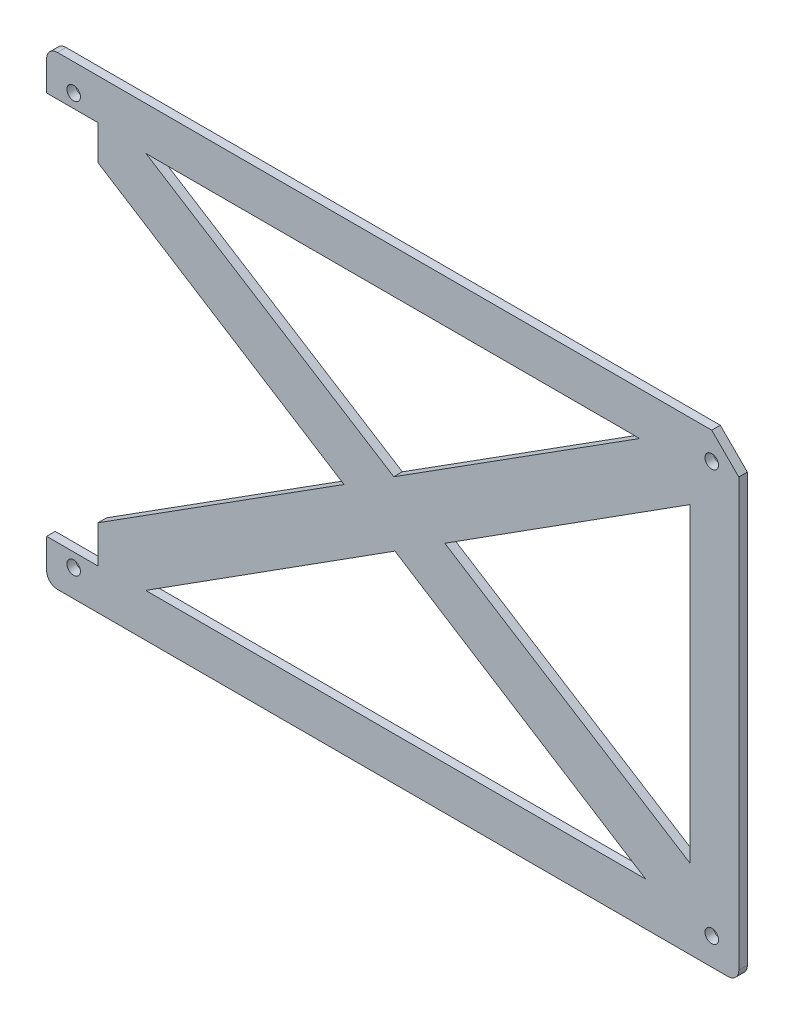
ISO-10303-21;
HEADER;
FILE_DESCRIPTION(('STEP AP214'),'2;1');
FILE_NAME('part.step','',(''),(''),'','','');
FILE_SCHEMA(('AUTOMOTIVE_DESIGN { 1 0 10303 214 1 1 1 1 }'));
ENDSEC;
DATA;
#1=APPLICATION_CONTEXT('core data for automotive mechanical design processes');
#2=APPLICATION_PROTOCOL_DEFINITION('international standard','automotive_design',2000,#1);
#3=PRODUCT_CONTEXT('',#1,'mechanical');
#4=PRODUCT('Part','Part','',(#3));
#5=PRODUCT_RELATED_PRODUCT_CATEGORY('part','',(#4));
#6=PRODUCT_DEFINITION_FORMATION('','',#4);
#7=PRODUCT_DEFINITION_CONTEXT('part definition',#1,'design');
#8=PRODUCT_DEFINITION('design','',#6,#7);
#9=PRODUCT_DEFINITION_SHAPE('','',#8);
#10=(LENGTH_UNIT() NAMED_UNIT(*) SI_UNIT(.MILLI.,.METRE.));
#11=(NAMED_UNIT(*) PLANE_ANGLE_UNIT() SI_UNIT($,.RADIAN.));
#12=(NAMED_UNIT(*) SI_UNIT($,.STERADIAN.) SOLID_ANGLE_UNIT());
#13=UNCERTAINTY_MEASURE_WITH_UNIT(LENGTH_MEASURE(1.E-05),#10,'distance_accuracy_value','');
#14=(GEOMETRIC_REPRESENTATION_CONTEXT(3) GLOBAL_UNCERTAINTY_ASSIGNED_CONTEXT((#13)) GLOBAL_UNIT_ASSIGNED_CONTEXT((#10,
#11,#12)) REPRESENTATION_CONTEXT('',''));
#15=CARTESIAN_POINT('',(0.,0.,0.));
#16=DIRECTION('',(0.,0.,1.));
#17=DIRECTION('',(1.,0.,0.));
#18=AXIS2_PLACEMENT_3D('',#15,#16,#17);
#19=CARTESIAN_POINT('',(62.00000000026,-40.999999998695,1.5875));
#20=DIRECTION('',(0.,0.,1.));
#21=DIRECTION('',(1.,0.,0.));
#22=AXIS2_PLACEMENT_3D('',#19,#20,#21);
#23=PLANE('',#22);
#24=CARTESIAN_POINT('',(59.00000000053,37.999999998965,1.5875));
#25=DIRECTION('',(0.,0.,1.));
#26=DIRECTION('',(1.,0.,0.));
#27=AXIS2_PLACEMENT_3D('',#24,#25,#26);
#28=CIRCLE('',#27,1.24999500014619);
#29=CARTESIAN_POINT('',(60.2499950006762,37.999999998965,1.5875));
#30=VERTEX_POINT('',#29);
#31=EDGE_CURVE('E275',#30,#30,#28,.T.);
#32=ORIENTED_EDGE('',*,*,#31,.F.);
#33=EDGE_LOOP('',(#32));
#34=FACE_BOUND('',#33,.T.);
#35=CARTESIAN_POINT('',(59.00000000053,-37.999999999715,1.5875));
#36=DIRECTION('',(0.,0.,1.));
#37=DIRECTION('',(1.,0.,0.));
#38=AXIS2_PLACEMENT_3D('',#35,#36,#37);
#39=CIRCLE('',#38,1.24999500014619);
#40=CARTESIAN_POINT('',(60.2499950006762,-37.999999999715,1.5875));
#41=VERTEX_POINT('',#40);
#42=EDGE_CURVE('E287',#41,#41,#39,.T.);
#43=ORIENTED_EDGE('',*,*,#42,.F.);
#44=EDGE_LOOP('',(#43));
#45=FACE_BOUND('',#44,.T.);
#46=CARTESIAN_POINT('',(62.00000000026,-40.999999998695,1.5875));
#47=DIRECTION('',(0.,0.,1.));
#48=DIRECTION('',(1.,0.,0.));
#49=AXIS2_PLACEMENT_3D('',#46,#47,#48);
#50=CIRCLE('',#49,2.00000000025);
#51=CARTESIAN_POINT('',(62.00000000026,-42.999999998945,1.5875));
#52=VERTEX_POINT('',#51);
#53=CARTESIAN_POINT('',(64.00000000051,-40.999999998695,1.5875));
#54=VERTEX_POINT('',#53);
#55=EDGE_CURVE('E293',#52,#54,#50,.T.);
#56=ORIENTED_EDGE('',*,*,#55,.T.);
#57=DIRECTION('',(0.,1.,0.));
#58=VECTOR('',#57,1.);
#59=CARTESIAN_POINT('',(64.00000000051,-40.999999998695,1.5875));
#60=LINE('',#59,#58);
#61=CARTESIAN_POINT('',(64.00000000051,37.999999998965,1.5875));
#62=VERTEX_POINT('',#61);
#63=EDGE_CURVE('E296',#54,#62,#60,.T.);
#64=ORIENTED_EDGE('',*,*,#63,.T.);
#65=DIRECTION('',(-0.707106781186548,0.707106781186548,0.));
#66=VECTOR('',#65,1.);
#67=CARTESIAN_POINT('',(64.00000000051,37.999999998965,1.5875));
#68=LINE('',#67,#66);
#69=CARTESIAN_POINT('',(59.00000000053,42.999999998945,1.5875));
#70=VERTEX_POINT('',#69);
#71=EDGE_CURVE('E299',#62,#70,#68,.T.);
#72=ORIENTED_EDGE('',*,*,#71,.T.);
#73=DIRECTION('',(-1.,0.,0.));
#74=VECTOR('',#73,1.);
#75=CARTESIAN_POINT('',(59.00000000053,42.999999998945,1.5875));
#76=LINE('',#75,#74);
#77=CARTESIAN_POINT('',(-62.00000000026,42.999999998945,1.5875));
#78=VERTEX_POINT('',#77);
#79=EDGE_CURVE('E301',#70,#78,#76,.T.);
#80=ORIENTED_EDGE('',*,*,#79,.T.);
#81=CARTESIAN_POINT('',(-62.00000000026,40.999999998695,1.5875));
#82=DIRECTION('',(0.,0.,1.));
#83=DIRECTION('',(1.,0.,0.));
#84=AXIS2_PLACEMENT_3D('',#81,#82,#83);
#85=CIRCLE('',#84,2.00000000025);
#86=CARTESIAN_POINT('',(-64.00000000051,40.999999998695,1.5875));
#87=VERTEX_POINT('',#86);
#88=EDGE_CURVE('E303',#78,#87,#85,.T.);
#89=ORIENTED_EDGE('',*,*,#88,.T.);
#90=DIRECTION('',(0.,-1.,0.));
#91=VECTOR('',#90,1.);
#92=CARTESIAN_POINT('',(-64.00000000051,40.999999998695,1.5875));
#93=LINE('',#92,#91);
#94=CARTESIAN_POINT('',(-64.00000000051,35.5,1.5875));
#95=VERTEX_POINT('',#94);
#96=EDGE_CURVE('E305',#87,#95,#93,.T.);
#97=ORIENTED_EDGE('',*,*,#96,.T.);
#98=DIRECTION('',(1.,0.,0.));
#99=VECTOR('',#98,1.);
#100=CARTESIAN_POINT('',(-64.00000000051,35.5,1.5875));
#101=LINE('',#100,#99);
#102=CARTESIAN_POINT('',(-54.50000000051,35.5,1.5875));
#103=VERTEX_POINT('',#102);
#104=EDGE_CURVE('E307',#95,#103,#101,.T.);
#105=ORIENTED_EDGE('',*,*,#104,.T.);
#106=DIRECTION('',(0.,-1.,0.));
#107=VECTOR('',#106,1.);
#108=CARTESIAN_POINT('',(-54.50000000051,35.5,1.5875));
#109=LINE('',#108,#107);
#110=CARTESIAN_POINT('',(-54.50000000051,29.0865436832252,1.5875));
#111=VERTEX_POINT('',#110);
#112=EDGE_CURVE('E309',#103,#111,#109,.T.);
#113=ORIENTED_EDGE('',*,*,#112,.T.);
#114=DIRECTION('',(0.84501184330285,-0.534747589688743,0.));
#115=VECTOR('',#114,1.);
#116=CARTESIAN_POINT('',(-54.50000000051,29.0865436832252,1.5875));
#117=LINE('',#116,#115);
#118=CARTESIAN_POINT('',(-9.0091115379995,0.298612305784743,1.5875));
#119=VERTEX_POINT('',#118);
#120=EDGE_CURVE('E311',#111,#119,#117,.T.);
#121=ORIENTED_EDGE('',*,*,#120,.T.);
#122=DIRECTION('',(-0.844309246651983,-0.535856227003065,0.));
#123=VECTOR('',#122,1.);
#124=CARTESIAN_POINT('',(-9.0091115379995,0.298612305784743,1.5875));
#125=LINE('',#124,#123);
#126=CARTESIAN_POINT('',(-54.50000000051,-28.5730078395599,1.5875));
#127=VERTEX_POINT('',#126);
#128=EDGE_CURVE('E313',#119,#127,#125,.T.);
#129=ORIENTED_EDGE('',*,*,#128,.T.);
#130=DIRECTION('',(0.,-1.,0.));
#131=VECTOR('',#130,1.);
#132=CARTESIAN_POINT('',(-54.50000000051,-28.5730078395599,1.5875));
#133=LINE('',#132,#131);
#134=CARTESIAN_POINT('',(-54.50000000051,-35.5,1.5875));
#135=VERTEX_POINT('',#134);
#136=EDGE_CURVE('E315',#127,#135,#133,.T.);
#137=ORIENTED_EDGE('',*,*,#136,.T.);
#138=DIRECTION('',(-1.,0.,0.));
#139=VECTOR('',#138,1.);
#140=CARTESIAN_POINT('',(-54.50000000051,-35.5,1.5875));
#141=LINE('',#140,#139);
#142=CARTESIAN_POINT('',(-64.00000000051,-35.5,1.5875));
#143=VERTEX_POINT('',#142);
#144=EDGE_CURVE('E317',#135,#143,#141,.T.);
#145=ORIENTED_EDGE('',*,*,#144,.T.);
#146=DIRECTION('',(0.,-1.,0.));
#147=VECTOR('',#146,1.);
#148=CARTESIAN_POINT('',(-64.00000000051,-35.5,1.5875));
#149=LINE('',#148,#147);
#150=CARTESIAN_POINT('',(-64.00000000051,-40.999999998695,1.5875));
#151=VERTEX_POINT('',#150);
#152=EDGE_CURVE('E319',#143,#151,#149,.T.);
#153=ORIENTED_EDGE('',*,*,#152,.T.);
#154=CARTESIAN_POINT('',(-62.00000000026,-40.999999998695,1.5875));
#155=DIRECTION('',(0.,0.,1.));
#156=DIRECTION('',(1.,0.,0.));
#157=AXIS2_PLACEMENT_3D('',#154,#155,#156);
#158=CIRCLE('',#157,2.00000000025);
#159=CARTESIAN_POINT('',(-62.00000000026,-42.999999998945,1.5875));
#160=VERTEX_POINT('',#159);
#161=EDGE_CURVE('E321',#151,#160,#158,.T.);
#162=ORIENTED_EDGE('',*,*,#161,.T.);
#163=DIRECTION('',(1.,0.,0.));
#164=VECTOR('',#163,1.);
#165=CARTESIAN_POINT('',(-62.00000000026,-42.999999998945,1.5875));
#166=LINE('',#165,#164);
#167=EDGE_CURVE('E323',#160,#52,#166,.T.);
#168=ORIENTED_EDGE('',*,*,#167,.T.);
#169=EDGE_LOOP('',(#56,#64,#72,#80,#89,#97,#105,#113,#121,#129,#137,#145,#153,#162,#168));
#170=FACE_BOUND('',#169,.T.);
#171=CARTESIAN_POINT('',(-59.00000000103,-37.999999999715,1.5875));
#172=DIRECTION('',(0.,0.,1.));
#173=DIRECTION('',(1.,0.,0.));
#174=AXIS2_PLACEMENT_3D('',#171,#172,#173);
#175=CIRCLE('',#174,1.24999500014617);
#176=CARTESIAN_POINT('',(-57.7500050008838,-37.999999999715,1.5875));
#177=VERTEX_POINT('',#176);
#178=EDGE_CURVE('E281',#177,#177,#175,.T.);
#179=ORIENTED_EDGE('',*,*,#178,.F.);
#180=EDGE_LOOP('',(#179));
#181=FACE_BOUND('',#180,.T.);
#182=CARTESIAN_POINT('',(-59.00000000103,37.999999998965,1.5875));
#183=DIRECTION('',(0.,0.,1.));
#184=DIRECTION('',(1.,0.,0.));
#185=AXIS2_PLACEMENT_3D('',#182,#183,#184);
#186=CIRCLE('',#185,1.24999500014617);
#187=CARTESIAN_POINT('',(-57.7500050008838,37.999999998965,1.5875));
#188=VERTEX_POINT('',#187);
#189=EDGE_CURVE('E269',#188,#188,#186,.T.);
#190=ORIENTED_EDGE('',*,*,#189,.F.);
#191=EDGE_LOOP('',(#190));
#192=FACE_BOUND('',#191,.T.);
#193=DIRECTION('',(0.844309246651983,0.535856227003066,0.));
#194=VECTOR('',#193,1.);
#195=CARTESIAN_POINT('',(45.6673128918372,34.999999998945,1.5875));
#196=LINE('',#195,#194);
#197=CARTESIAN_POINT('',(0.200195403707151,6.14346653504343,1.5875));
#198=VERTEX_POINT('',#197);
#199=CARTESIAN_POINT('',(45.6673128918372,34.999999998945,1.5875));
#200=VERTEX_POINT('',#199);
#201=EDGE_CURVE('E247',#198,#200,#196,.T.);
#202=ORIENTED_EDGE('',*,*,#201,.F.);
#203=DIRECTION('',(0.846198586290304,-0.532867668901286,0.));
#204=VECTOR('',#203,1.);
#205=CARTESIAN_POINT('',(-45.6242357777534,34.9999999989449,1.5875));
#206=LINE('',#205,#204);
#207=CARTESIAN_POINT('',(-45.6242357777534,34.9999999989449,1.5875));
#208=VERTEX_POINT('',#207);
#209=EDGE_CURVE('E245',#208,#198,#206,.T.);
#210=ORIENTED_EDGE('',*,*,#209,.F.);
#211=DIRECTION('',(-1.,0.,0.));
#212=VECTOR('',#211,1.);
#213=CARTESIAN_POINT('',(-45.6242357777534,34.9999999989449,1.5875));
#214=LINE('',#213,#212);
#215=EDGE_CURVE('E251',#200,#208,#214,.T.);
#216=ORIENTED_EDGE('',*,*,#215,.F.);
#217=EDGE_LOOP('',(#202,#210,#216));
#218=FACE_BOUND('',#217,.T.);
#219=DIRECTION('',(-0.843598214141836,-0.536974909187296,0.));
#220=VECTOR('',#219,1.);
#221=CARTESIAN_POINT('',(0.409618796281007,-5.6618288218784,1.5875));
#222=LINE('',#221,#220);
#223=CARTESIAN_POINT('',(0.409618796281007,-5.6618288218784,1.5875));
#224=VERTEX_POINT('',#223);
#225=CARTESIAN_POINT('',(-45.6812290025838,-34.999999998945,1.5875));
#226=VERTEX_POINT('',#225);
#227=EDGE_CURVE('E223',#224,#226,#222,.T.);
#228=ORIENTED_EDGE('',*,*,#227,.F.);
#229=DIRECTION('',(-0.845011843302849,0.534747589688744,0.));
#230=VECTOR('',#229,1.);
#231=CARTESIAN_POINT('',(0.409618796281007,-5.6618288218784,1.5875));
#232=LINE('',#231,#230);
#233=CARTESIAN_POINT('',(46.7699999994905,-34.9999999989451,1.5875));
#234=VERTEX_POINT('',#233);
#235=EDGE_CURVE('E221',#234,#224,#232,.T.);
#236=ORIENTED_EDGE('',*,*,#235,.F.);
#237=DIRECTION('',(1.,0.,0.));
#238=VECTOR('',#237,1.);
#239=CARTESIAN_POINT('',(-45.6812290025838,-34.999999998945,1.5875));
#240=LINE('',#239,#238);
#241=EDGE_CURVE('E227',#226,#234,#240,.T.);
#242=ORIENTED_EDGE('',*,*,#241,.F.);
#243=EDGE_LOOP('',(#228,#236,#242));
#244=FACE_BOUND('',#243,.T.);
#245=DIRECTION('',(0.,1.,0.));
#246=VECTOR('',#245,1.);
#247=CARTESIAN_POINT('',(55.0000000005099,29.0865436832252,1.5875));
#248=LINE('',#247,#246);
#249=CARTESIAN_POINT('',(55.0000000005101,-28.3650337210967,1.5875));
#250=VERTEX_POINT('',#249);
#251=CARTESIAN_POINT('',(55.0000000005099,29.0865436832252,1.5875));
#252=VERTEX_POINT('',#251);
#253=EDGE_CURVE('E202',#250,#252,#248,.T.);
#254=ORIENTED_EDGE('',*,*,#253,.F.);
#255=DIRECTION('',(0.846198586290304,-0.532867668901286,0.));
#256=VECTOR('',#255,1.);
#257=CARTESIAN_POINT('',(9.62851721152225,0.206269351334123,1.5875));
#258=LINE('',#257,#256);
#259=CARTESIAN_POINT('',(9.62851721152225,0.206269351334123,1.5875));
#260=VERTEX_POINT('',#259);
#261=EDGE_CURVE('E194',#260,#250,#258,.T.);
#262=ORIENTED_EDGE('',*,*,#261,.F.);
#263=DIRECTION('',(-0.843598214141836,-0.536974909187296,0.));
#264=VECTOR('',#263,1.);
#265=CARTESIAN_POINT('',(55.0000000005099,29.0865436832252,1.5875));
#266=LINE('',#265,#264);
#267=EDGE_CURVE('E211',#252,#260,#266,.T.);
#268=ORIENTED_EDGE('',*,*,#267,.F.);
#269=EDGE_LOOP('',(#254,#262,#268));
#270=FACE_BOUND('',#269,.T.);
#271=ADVANCED_FACE('F33',(#34,#45,#170,#181,#192,#218,#244,#270),#23,.T.);
#272=CARTESIAN_POINT('',(62.00000000026,-40.999999998695,0.));
#273=DIRECTION('',(0.,0.,1.));
#274=DIRECTION('',(1.,0.,0.));
#275=AXIS2_PLACEMENT_3D('',#272,#273,#274);
#276=PLANE('',#275);
#277=DIRECTION('',(-0.845011843302849,0.534747589688744,0.));
#278=VECTOR('',#277,1.);
#279=CARTESIAN_POINT('',(0.409618796281007,-5.6618288218784,0.));
#280=LINE('',#279,#278);
#281=CARTESIAN_POINT('',(46.7699999994905,-34.9999999989451,0.));
#282=VERTEX_POINT('',#281);
#283=CARTESIAN_POINT('',(0.409618796281007,-5.6618288218784,0.));
#284=VERTEX_POINT('',#283);
#285=EDGE_CURVE('E209',#282,#284,#280,.T.);
#286=ORIENTED_EDGE('',*,*,#285,.T.);
#287=DIRECTION('',(-0.843598214141836,-0.536974909187296,0.));
#288=VECTOR('',#287,1.);
#289=CARTESIAN_POINT('',(0.409618796281007,-5.6618288218784,0.));
#290=LINE('',#289,#288);
#291=CARTESIAN_POINT('',(-45.6812290025838,-34.999999998945,0.));
#292=VERTEX_POINT('',#291);
#293=EDGE_CURVE('E232',#284,#292,#290,.T.);
#294=ORIENTED_EDGE('',*,*,#293,.T.);
#295=DIRECTION('',(1.,0.,0.));
#296=VECTOR('',#295,1.);
#297=CARTESIAN_POINT('',(-45.6812290025838,-34.999999998945,0.));
#298=LINE('',#297,#296);
#299=EDGE_CURVE('E224',#292,#282,#298,.T.);
#300=ORIENTED_EDGE('',*,*,#299,.T.);
#301=EDGE_LOOP('',(#286,#294,#300));
#302=FACE_BOUND('',#301,.T.);
#303=CARTESIAN_POINT('',(-59.00000000103,37.999999998965,0.));
#304=DIRECTION('',(0.,0.,1.));
#305=DIRECTION('',(1.,0.,0.));
#306=AXIS2_PLACEMENT_3D('',#303,#304,#305);
#307=CIRCLE('',#306,1.24999500014617);
#308=CARTESIAN_POINT('',(-57.7500050008838,37.999999998965,0.));
#309=VERTEX_POINT('',#308);
#310=EDGE_CURVE('E268',#309,#309,#307,.T.);
#311=ORIENTED_EDGE('',*,*,#310,.T.);
#312=EDGE_LOOP('',(#311));
#313=FACE_BOUND('',#312,.T.);
#314=CARTESIAN_POINT('',(59.00000000053,37.999999998965,0.));
#315=DIRECTION('',(0.,0.,1.));
#316=DIRECTION('',(1.,0.,0.));
#317=AXIS2_PLACEMENT_3D('',#314,#315,#316);
#318=CIRCLE('',#317,1.24999500014619);
#319=CARTESIAN_POINT('',(60.2499950006762,37.999999998965,0.));
#320=VERTEX_POINT('',#319);
#321=EDGE_CURVE('E272',#320,#320,#318,.T.);
#322=ORIENTED_EDGE('',*,*,#321,.T.);
#323=EDGE_LOOP('',(#322));
#324=FACE_BOUND('',#323,.T.);
#325=CARTESIAN_POINT('',(-59.00000000103,-37.999999999715,0.));
#326=DIRECTION('',(0.,0.,1.));
#327=DIRECTION('',(1.,0.,0.));
#328=AXIS2_PLACEMENT_3D('',#325,#326,#327);
#329=CIRCLE('',#328,1.24999500014617);
#330=CARTESIAN_POINT('',(-57.7500050008838,-37.999999999715,0.));
#331=VERTEX_POINT('',#330);
#332=EDGE_CURVE('E278',#331,#331,#329,.T.);
#333=ORIENTED_EDGE('',*,*,#332,.T.);
#334=EDGE_LOOP('',(#333));
#335=FACE_BOUND('',#334,.T.);
#336=CARTESIAN_POINT('',(59.00000000053,-37.999999999715,0.));
#337=DIRECTION('',(0.,0.,1.));
#338=DIRECTION('',(1.,0.,0.));
#339=AXIS2_PLACEMENT_3D('',#336,#337,#338);
#340=CIRCLE('',#339,1.24999500014619);
#341=CARTESIAN_POINT('',(60.2499950006762,-37.999999999715,0.));
#342=VERTEX_POINT('',#341);
#343=EDGE_CURVE('E284',#342,#342,#340,.T.);
#344=ORIENTED_EDGE('',*,*,#343,.T.);
#345=EDGE_LOOP('',(#344));
#346=FACE_BOUND('',#345,.T.);
#347=CARTESIAN_POINT('',(62.00000000026,-40.999999998695,0.));
#348=DIRECTION('',(0.,0.,1.));
#349=DIRECTION('',(1.,0.,0.));
#350=AXIS2_PLACEMENT_3D('',#347,#348,#349);
#351=CIRCLE('',#350,2.00000000025);
#352=CARTESIAN_POINT('',(62.00000000026,-42.999999998945,0.));
#353=VERTEX_POINT('',#352);
#354=CARTESIAN_POINT('',(64.00000000051,-40.999999998695,0.));
#355=VERTEX_POINT('',#354);
#356=EDGE_CURVE('E290',#353,#355,#351,.T.);
#357=ORIENTED_EDGE('',*,*,#356,.F.);
#358=DIRECTION('',(1.,0.,0.));
#359=VECTOR('',#358,1.);
#360=CARTESIAN_POINT('',(-62.00000000026,-42.999999998945,0.));
#361=LINE('',#360,#359);
#362=CARTESIAN_POINT('',(-62.00000000026,-42.999999998945,0.));
#363=VERTEX_POINT('',#362);
#364=EDGE_CURVE('E297',#363,#353,#361,.T.);
#365=ORIENTED_EDGE('',*,*,#364,.F.);
#366=CARTESIAN_POINT('',(-62.00000000026,-40.999999998695,0.));
#367=DIRECTION('',(0.,0.,1.));
#368=DIRECTION('',(1.,0.,0.));
#369=AXIS2_PLACEMENT_3D('',#366,#367,#368);
#370=CIRCLE('',#369,2.00000000025);
#371=CARTESIAN_POINT('',(-64.00000000051,-40.999999998695,0.));
#372=VERTEX_POINT('',#371);
#373=EDGE_CURVE('E352',#372,#363,#370,.T.);
#374=ORIENTED_EDGE('',*,*,#373,.F.);
#375=DIRECTION('',(0.,-1.,0.));
#376=VECTOR('',#375,1.);
#377=CARTESIAN_POINT('',(-64.00000000051,-35.5,0.));
#378=LINE('',#377,#376);
#379=CARTESIAN_POINT('',(-64.00000000051,-35.5,0.));
#380=VERTEX_POINT('',#379);
#381=EDGE_CURVE('E350',#380,#372,#378,.T.);
#382=ORIENTED_EDGE('',*,*,#381,.F.);
#383=DIRECTION('',(-1.,0.,0.));
#384=VECTOR('',#383,1.);
#385=CARTESIAN_POINT('',(-54.50000000051,-35.5,0.));
#386=LINE('',#385,#384);
#387=CARTESIAN_POINT('',(-54.50000000051,-35.5,0.));
#388=VERTEX_POINT('',#387);
#389=EDGE_CURVE('E348',#388,#380,#386,.T.);
#390=ORIENTED_EDGE('',*,*,#389,.F.);
#391=DIRECTION('',(0.,-1.,0.));
#392=VECTOR('',#391,1.);
#393=CARTESIAN_POINT('',(-54.50000000051,-28.5730078395599,0.));
#394=LINE('',#393,#392);
#395=CARTESIAN_POINT('',(-54.50000000051,-28.5730078395599,0.));
#396=VERTEX_POINT('',#395);
#397=EDGE_CURVE('E346',#396,#388,#394,.T.);
#398=ORIENTED_EDGE('',*,*,#397,.F.);
#399=DIRECTION('',(-0.844309246651983,-0.535856227003065,0.));
#400=VECTOR('',#399,1.);
#401=CARTESIAN_POINT('',(-9.0091115379995,0.298612305784743,0.));
#402=LINE('',#401,#400);
#403=CARTESIAN_POINT('',(-9.0091115379995,0.298612305784743,0.));
#404=VERTEX_POINT('',#403);
#405=EDGE_CURVE('E344',#404,#396,#402,.T.);
#406=ORIENTED_EDGE('',*,*,#405,.F.);
#407=DIRECTION('',(0.84501184330285,-0.534747589688743,0.));
#408=VECTOR('',#407,1.);
#409=CARTESIAN_POINT('',(-54.50000000051,29.0865436832252,0.));
#410=LINE('',#409,#408);
#411=CARTESIAN_POINT('',(-54.50000000051,29.0865436832252,0.));
#412=VERTEX_POINT('',#411);
#413=EDGE_CURVE('E342',#412,#404,#410,.T.);
#414=ORIENTED_EDGE('',*,*,#413,.F.);
#415=DIRECTION('',(0.,-1.,0.));
#416=VECTOR('',#415,1.);
#417=CARTESIAN_POINT('',(-54.50000000051,35.5,0.));
#418=LINE('',#417,#416);
#419=CARTESIAN_POINT('',(-54.50000000051,35.5,0.));
#420=VERTEX_POINT('',#419);
#421=EDGE_CURVE('E340',#420,#412,#418,.T.);
#422=ORIENTED_EDGE('',*,*,#421,.F.);
#423=DIRECTION('',(1.,0.,0.));
#424=VECTOR('',#423,1.);
#425=CARTESIAN_POINT('',(-64.00000000051,35.5,0.));
#426=LINE('',#425,#424);
#427=CARTESIAN_POINT('',(-64.00000000051,35.5,0.));
#428=VERTEX_POINT('',#427);
#429=EDGE_CURVE('E338',#428,#420,#426,.T.);
#430=ORIENTED_EDGE('',*,*,#429,.F.);
#431=DIRECTION('',(0.,-1.,0.));
#432=VECTOR('',#431,1.);
#433=CARTESIAN_POINT('',(-64.00000000051,40.999999998695,0.));
#434=LINE('',#433,#432);
#435=CARTESIAN_POINT('',(-64.00000000051,40.999999998695,0.));
#436=VERTEX_POINT('',#435);
#437=EDGE_CURVE('E336',#436,#428,#434,.T.);
#438=ORIENTED_EDGE('',*,*,#437,.F.);
#439=CARTESIAN_POINT('',(-62.00000000026,40.999999998695,0.));
#440=DIRECTION('',(0.,0.,1.));
#441=DIRECTION('',(1.,0.,0.));
#442=AXIS2_PLACEMENT_3D('',#439,#440,#441);
#443=CIRCLE('',#442,2.00000000025);
#444=CARTESIAN_POINT('',(-62.00000000026,42.999999998945,0.));
#445=VERTEX_POINT('',#444);
#446=EDGE_CURVE('E334',#445,#436,#443,.T.);
#447=ORIENTED_EDGE('',*,*,#446,.F.);
#448=DIRECTION('',(-1.,0.,0.));
#449=VECTOR('',#448,1.);
#450=CARTESIAN_POINT('',(59.00000000053,42.999999998945,0.));
#451=LINE('',#450,#449);
#452=CARTESIAN_POINT('',(59.00000000053,42.999999998945,0.));
#453=VERTEX_POINT('',#452);
#454=EDGE_CURVE('E332',#453,#445,#451,.T.);
#455=ORIENTED_EDGE('',*,*,#454,.F.);
#456=DIRECTION('',(-0.707106781186548,0.707106781186548,0.));
#457=VECTOR('',#456,1.);
#458=CARTESIAN_POINT('',(64.00000000051,37.999999998965,0.));
#459=LINE('',#458,#457);
#460=CARTESIAN_POINT('',(64.00000000051,37.999999998965,0.));
#461=VERTEX_POINT('',#460);
#462=EDGE_CURVE('E330',#461,#453,#459,.T.);
#463=ORIENTED_EDGE('',*,*,#462,.F.);
#464=DIRECTION('',(0.,1.,0.));
#465=VECTOR('',#464,1.);
#466=CARTESIAN_POINT('',(64.00000000051,-40.999999998695,0.));
#467=LINE('',#466,#465);
#468=EDGE_CURVE('E328',#355,#461,#467,.T.);
#469=ORIENTED_EDGE('',*,*,#468,.F.);
#470=EDGE_LOOP('',(#357,#365,#374,#382,#390,#398,#406,#414,#422,#430,#438,#447,#455,#463,#469));
#471=FACE_BOUND('',#470,.T.);
#472=DIRECTION('',(0.846198586290304,-0.532867668901286,0.));
#473=VECTOR('',#472,1.);
#474=CARTESIAN_POINT('',(-45.6242357777534,34.9999999989449,0.));
#475=LINE('',#474,#473);
#476=CARTESIAN_POINT('',(-45.6242357777534,34.9999999989449,0.));
#477=VERTEX_POINT('',#476);
#478=CARTESIAN_POINT('',(0.200195403707151,6.14346653504343,0.));
#479=VERTEX_POINT('',#478);
#480=EDGE_CURVE('E244',#477,#479,#475,.T.);
#481=ORIENTED_EDGE('',*,*,#480,.T.);
#482=DIRECTION('',(0.844309246651983,0.535856227003066,0.));
#483=VECTOR('',#482,1.);
#484=CARTESIAN_POINT('',(45.6673128918372,34.999999998945,0.));
#485=LINE('',#484,#483);
#486=CARTESIAN_POINT('',(45.6673128918372,34.999999998945,0.));
#487=VERTEX_POINT('',#486);
#488=EDGE_CURVE('E256',#479,#487,#485,.T.);
#489=ORIENTED_EDGE('',*,*,#488,.T.);
#490=DIRECTION('',(-1.,0.,0.));
#491=VECTOR('',#490,1.);
#492=CARTESIAN_POINT('',(-45.6242357777534,34.9999999989449,0.));
#493=LINE('',#492,#491);
#494=EDGE_CURVE('E248',#487,#477,#493,.T.);
#495=ORIENTED_EDGE('',*,*,#494,.T.);
#496=EDGE_LOOP('',(#481,#489,#495));
#497=FACE_BOUND('',#496,.T.);
#498=DIRECTION('',(0.846198586290304,-0.532867668901286,0.));
#499=VECTOR('',#498,1.);
#500=CARTESIAN_POINT('',(9.62851721152225,0.206269351334123,0.));
#501=LINE('',#500,#499);
#502=CARTESIAN_POINT('',(9.62851721152224,0.206269351334139,0.));
#503=VERTEX_POINT('',#502);
#504=CARTESIAN_POINT('',(55.0000000005101,-28.3650337210967,0.));
#505=VERTEX_POINT('',#504);
#506=EDGE_CURVE('E56',#503,#505,#501,.T.);
#507=ORIENTED_EDGE('',*,*,#506,.T.);
#508=DIRECTION('',(0.,1.,0.));
#509=VECTOR('',#508,1.);
#510=CARTESIAN_POINT('',(55.0000000005099,29.0865436832252,0.));
#511=LINE('',#510,#509);
#512=CARTESIAN_POINT('',(55.0000000005099,29.0865436832252,0.));
#513=VERTEX_POINT('',#512);
#514=EDGE_CURVE('E208',#505,#513,#511,.T.);
#515=ORIENTED_EDGE('',*,*,#514,.T.);
#516=DIRECTION('',(-0.843598214141836,-0.536974909187296,0.));
#517=VECTOR('',#516,1.);
#518=CARTESIAN_POINT('',(55.0000000005099,29.0865436832252,0.));
#519=LINE('',#518,#517);
#520=EDGE_CURVE('E203',#513,#503,#519,.T.);
#521=ORIENTED_EDGE('',*,*,#520,.T.);
#522=EDGE_LOOP('',(#507,#515,#521));
#523=FACE_BOUND('',#522,.T.);
#524=ADVANCED_FACE('F403',(#302,#313,#324,#335,#346,#471,#497,#523),#276,.F.);
#525=CARTESIAN_POINT('',(62.00000000026,-40.999999998695,1.5875));
#526=DIRECTION('',(0.,0.,-1.));
#527=DIRECTION('',(-1.,0.,0.));
#528=AXIS2_PLACEMENT_3D('',#525,#526,#527);
#529=CYLINDRICAL_SURFACE('',#528,2.00000000025);
#530=ORIENTED_EDGE('',*,*,#356,.T.);
#531=DIRECTION('',(0.,0.,-1.));
#532=VECTOR('',#531,1.);
#533=CARTESIAN_POINT('',(64.00000000051,-40.999999998695,1.5875));
#534=LINE('',#533,#532);
#535=EDGE_CURVE('E11',#54,#355,#534,.T.);
#536=ORIENTED_EDGE('',*,*,#535,.F.);
#537=ORIENTED_EDGE('',*,*,#55,.F.);
#538=DIRECTION('',(0.,0.,-1.));
#539=VECTOR('',#538,1.);
#540=CARTESIAN_POINT('',(62.00000000026,-42.999999998945,1.5875));
#541=LINE('',#540,#539);
#542=EDGE_CURVE('E325',#52,#353,#541,.T.);
#543=ORIENTED_EDGE('',*,*,#542,.T.);
#544=EDGE_LOOP('',(#530,#536,#537,#543));
#545=FACE_BOUND('',#544,.T.);
#546=ADVANCED_FACE('F35',(#545),#529,.T.);
#547=CARTESIAN_POINT('',(64.00000000051,-40.999999998695,1.5875));
#548=DIRECTION('',(-1.,0.,0.));
#549=DIRECTION('',(0.,0.,1.));
#550=AXIS2_PLACEMENT_3D('',#547,#548,#549);
#551=PLANE('',#550);
#552=ORIENTED_EDGE('',*,*,#468,.T.);
#553=DIRECTION('',(0.,0.,-1.));
#554=VECTOR('',#553,1.);
#555=CARTESIAN_POINT('',(64.00000000051,37.999999998965,1.5875));
#556=LINE('',#555,#554);
#557=EDGE_CURVE('E41',#62,#461,#556,.T.);
#558=ORIENTED_EDGE('',*,*,#557,.F.);
#559=ORIENTED_EDGE('',*,*,#63,.F.);
#560=ORIENTED_EDGE('',*,*,#535,.T.);
#561=EDGE_LOOP('',(#552,#558,#559,#560));
#562=FACE_BOUND('',#561,.T.);
#563=ADVANCED_FACE('F421',(#562),#551,.F.);
#564=CARTESIAN_POINT('',(64.00000000051,37.999999998965,1.5875));
#565=DIRECTION('',(-0.707106781186548,-0.707106781186548,0.));
#566=DIRECTION('',(0.707106781186548,-0.707106781186548,0.));
#567=AXIS2_PLACEMENT_3D('',#564,#565,#566);
#568=PLANE('',#567);
#569=ORIENTED_EDGE('',*,*,#462,.T.);
#570=DIRECTION('',(0.,0.,-1.));
#571=VECTOR('',#570,1.);
#572=CARTESIAN_POINT('',(59.00000000053,42.999999998945,1.5875));
#573=LINE('',#572,#571);
#574=EDGE_CURVE('E390',#70,#453,#573,.T.);
#575=ORIENTED_EDGE('',*,*,#574,.F.);
#576=ORIENTED_EDGE('',*,*,#71,.F.);
#577=ORIENTED_EDGE('',*,*,#557,.T.);
#578=EDGE_LOOP('',(#569,#575,#576,#577));
#579=FACE_BOUND('',#578,.T.);
#580=ADVANCED_FACE('F397',(#579),#568,.F.);
#581=CARTESIAN_POINT('',(59.00000000053,42.999999998945,1.5875));
#582=DIRECTION('',(0.,-1.,0.));
#583=DIRECTION('',(0.,0.,-1.));
#584=AXIS2_PLACEMENT_3D('',#581,#582,#583);
#585=PLANE('',#584);
#586=ORIENTED_EDGE('',*,*,#454,.T.);
#587=DIRECTION('',(0.,0.,-1.));
#588=VECTOR('',#587,1.);
#589=CARTESIAN_POINT('',(-62.00000000026,42.999999998945,1.5875));
#590=LINE('',#589,#588);
#591=EDGE_CURVE('E387',#78,#445,#590,.T.);
#592=ORIENTED_EDGE('',*,*,#591,.F.);
#593=ORIENTED_EDGE('',*,*,#79,.F.);
#594=ORIENTED_EDGE('',*,*,#574,.T.);
#595=EDGE_LOOP('',(#586,#592,#593,#594));
#596=FACE_BOUND('',#595,.T.);
#597=ADVANCED_FACE('F409',(#596),#585,.F.);
#598=CARTESIAN_POINT('',(-62.00000000026,40.999999998695,1.5875));
#599=DIRECTION('',(0.,0.,-1.));
#600=DIRECTION('',(-1.,0.,0.));
#601=AXIS2_PLACEMENT_3D('',#598,#599,#600);
#602=CYLINDRICAL_SURFACE('',#601,2.00000000025);
#603=ORIENTED_EDGE('',*,*,#446,.T.);
#604=DIRECTION('',(0.,0.,-1.));
#605=VECTOR('',#604,1.);
#606=CARTESIAN_POINT('',(-64.00000000051,40.999999998695,1.5875));
#607=LINE('',#606,#605);
#608=EDGE_CURVE('E384',#87,#436,#607,.T.);
#609=ORIENTED_EDGE('',*,*,#608,.F.);
#610=ORIENTED_EDGE('',*,*,#88,.F.);
#611=ORIENTED_EDGE('',*,*,#591,.T.);
#612=EDGE_LOOP('',(#603,#609,#610,#611));
#613=FACE_BOUND('',#612,.T.);
#614=ADVANCED_FACE('F413',(#613),#602,.T.);
#615=CARTESIAN_POINT('',(-64.00000000051,40.999999998695,1.5875));
#616=DIRECTION('',(1.,0.,0.));
#617=DIRECTION('',(0.,0.,-1.));
#618=AXIS2_PLACEMENT_3D('',#615,#616,#617);
#619=PLANE('',#618);
#620=ORIENTED_EDGE('',*,*,#437,.T.);
#621=DIRECTION('',(0.,0.,-1.));
#622=VECTOR('',#621,1.);
#623=CARTESIAN_POINT('',(-64.00000000051,35.5,1.5875));
#624=LINE('',#623,#622);
#625=EDGE_CURVE('E381',#95,#428,#624,.T.);
#626=ORIENTED_EDGE('',*,*,#625,.F.);
#627=ORIENTED_EDGE('',*,*,#96,.F.);
#628=ORIENTED_EDGE('',*,*,#608,.T.);
#629=EDGE_LOOP('',(#620,#626,#627,#628));
#630=FACE_BOUND('',#629,.T.);
#631=ADVANCED_FACE('F469',(#630),#619,.F.);
#632=CARTESIAN_POINT('',(-64.00000000051,35.5,1.5875));
#633=DIRECTION('',(0.,1.,0.));
#634=DIRECTION('',(-1.,0.,0.));
#635=AXIS2_PLACEMENT_3D('',#632,#633,#634);
#636=PLANE('',#635);
#637=ORIENTED_EDGE('',*,*,#429,.T.);
#638=DIRECTION('',(0.,0.,-1.));
#639=VECTOR('',#638,1.);
#640=CARTESIAN_POINT('',(-54.50000000051,35.5,1.5875));
#641=LINE('',#640,#639);
#642=EDGE_CURVE('E378',#103,#420,#641,.T.);
#643=ORIENTED_EDGE('',*,*,#642,.F.);
#644=ORIENTED_EDGE('',*,*,#104,.F.);
#645=ORIENTED_EDGE('',*,*,#625,.T.);
#646=EDGE_LOOP('',(#637,#643,#644,#645));
#647=FACE_BOUND('',#646,.T.);
#648=ADVANCED_FACE('F467',(#647),#636,.F.);
#649=CARTESIAN_POINT('',(-54.50000000051,35.5,1.5875));
#650=DIRECTION('',(1.,0.,0.));
#651=DIRECTION('',(0.,0.,-1.));
#652=AXIS2_PLACEMENT_3D('',#649,#650,#651);
#653=PLANE('',#652);
#654=ORIENTED_EDGE('',*,*,#421,.T.);
#655=DIRECTION('',(0.,0.,-1.));
#656=VECTOR('',#655,1.);
#657=CARTESIAN_POINT('',(-54.50000000051,29.0865436832252,1.5875));
#658=LINE('',#657,#656);
#659=EDGE_CURVE('E375',#111,#412,#658,.T.);
#660=ORIENTED_EDGE('',*,*,#659,.F.);
#661=ORIENTED_EDGE('',*,*,#112,.F.);
#662=ORIENTED_EDGE('',*,*,#642,.T.);
#663=EDGE_LOOP('',(#654,#660,#661,#662));
#664=FACE_BOUND('',#663,.T.);
#665=ADVANCED_FACE('F463',(#664),#653,.F.);
#666=CARTESIAN_POINT('',(-54.50000000051,29.0865436832252,1.5875));
#667=DIRECTION('',(0.534747589688743,0.84501184330285,0.));
#668=DIRECTION('',(-0.84501184330285,0.534747589688743,0.));
#669=AXIS2_PLACEMENT_3D('',#666,#667,#668);
#670=PLANE('',#669);
#671=ORIENTED_EDGE('',*,*,#413,.T.);
#672=DIRECTION('',(0.,0.,-1.));
#673=VECTOR('',#672,1.);
#674=CARTESIAN_POINT('',(-9.0091115379995,0.298612305784743,1.5875));
#675=LINE('',#674,#673);
#676=EDGE_CURVE('E372',#119,#404,#675,.T.);
#677=ORIENTED_EDGE('',*,*,#676,.F.);
#678=ORIENTED_EDGE('',*,*,#120,.F.);
#679=ORIENTED_EDGE('',*,*,#659,.T.);
#680=EDGE_LOOP('',(#671,#677,#678,#679));
#681=FACE_BOUND('',#680,.T.);
#682=ADVANCED_FACE('F458',(#681),#670,.F.);
#683=CARTESIAN_POINT('',(-9.0091115379995,0.298612305784743,1.5875));
#684=DIRECTION('',(0.535856227003065,-0.844309246651983,0.));
#685=DIRECTION('',(0.844309246651984,0.535856227003065,0.));
#686=AXIS2_PLACEMENT_3D('',#683,#684,#685);
#687=PLANE('',#686);
#688=ORIENTED_EDGE('',*,*,#405,.T.);
#689=DIRECTION('',(0.,0.,-1.));
#690=VECTOR('',#689,1.);
#691=CARTESIAN_POINT('',(-54.50000000051,-28.5730078395599,1.5875));
#692=LINE('',#691,#690);
#693=EDGE_CURVE('E369',#127,#396,#692,.T.);
#694=ORIENTED_EDGE('',*,*,#693,.F.);
#695=ORIENTED_EDGE('',*,*,#128,.F.);
#696=ORIENTED_EDGE('',*,*,#676,.T.);
#697=EDGE_LOOP('',(#688,#694,#695,#696));
#698=FACE_BOUND('',#697,.T.);
#699=ADVANCED_FACE('F452',(#698),#687,.F.);
#700=CARTESIAN_POINT('',(-54.50000000051,-28.5730078395599,1.5875));
#701=DIRECTION('',(1.,0.,0.));
#702=DIRECTION('',(0.,0.,-1.));
#703=AXIS2_PLACEMENT_3D('',#700,#701,#702);
#704=PLANE('',#703);
#705=ORIENTED_EDGE('',*,*,#397,.T.);
#706=DIRECTION('',(0.,0.,-1.));
#707=VECTOR('',#706,1.);
#708=CARTESIAN_POINT('',(-54.50000000051,-35.5,1.5875));
#709=LINE('',#708,#707);
#710=EDGE_CURVE('E366',#135,#388,#709,.T.);
#711=ORIENTED_EDGE('',*,*,#710,.F.);
#712=ORIENTED_EDGE('',*,*,#136,.F.);
#713=ORIENTED_EDGE('',*,*,#693,.T.);
#714=EDGE_LOOP('',(#705,#711,#712,#713));
#715=FACE_BOUND('',#714,.T.);
#716=ADVANCED_FACE('F448',(#715),#704,.F.);
#717=CARTESIAN_POINT('',(-54.50000000051,-35.5,1.5875));
#718=DIRECTION('',(0.,-1.,0.));
#719=DIRECTION('',(0.,0.,-1.));
#720=AXIS2_PLACEMENT_3D('',#717,#718,#719);
#721=PLANE('',#720);
#722=ORIENTED_EDGE('',*,*,#389,.T.);
#723=DIRECTION('',(0.,0.,-1.));
#724=VECTOR('',#723,1.);
#725=CARTESIAN_POINT('',(-64.00000000051,-35.5,1.5875));
#726=LINE('',#725,#724);
#727=EDGE_CURVE('E363',#143,#380,#726,.T.);
#728=ORIENTED_EDGE('',*,*,#727,.F.);
#729=ORIENTED_EDGE('',*,*,#144,.F.);
#730=ORIENTED_EDGE('',*,*,#710,.T.);
#731=EDGE_LOOP('',(#722,#728,#729,#730));
#732=FACE_BOUND('',#731,.T.);
#733=ADVANCED_FACE('F443',(#732),#721,.F.);
#734=CARTESIAN_POINT('',(-64.00000000051,-35.5,1.5875));
#735=DIRECTION('',(1.,0.,0.));
#736=DIRECTION('',(0.,0.,-1.));
#737=AXIS2_PLACEMENT_3D('',#734,#735,#736);
#738=PLANE('',#737);
#739=ORIENTED_EDGE('',*,*,#381,.T.);
#740=DIRECTION('',(0.,0.,-1.));
#741=VECTOR('',#740,1.);
#742=CARTESIAN_POINT('',(-64.00000000051,-40.999999998695,1.5875));
#743=LINE('',#742,#741);
#744=EDGE_CURVE('E360',#151,#372,#743,.T.);
#745=ORIENTED_EDGE('',*,*,#744,.F.);
#746=ORIENTED_EDGE('',*,*,#152,.F.);
#747=ORIENTED_EDGE('',*,*,#727,.T.);
#748=EDGE_LOOP('',(#739,#745,#746,#747));
#749=FACE_BOUND('',#748,.T.);
#750=ADVANCED_FACE('F437',(#749),#738,.F.);
#751=CARTESIAN_POINT('',(-62.00000000026,-40.999999998695,1.5875));
#752=DIRECTION('',(0.,0.,-1.));
#753=DIRECTION('',(-1.,0.,0.));
#754=AXIS2_PLACEMENT_3D('',#751,#752,#753);
#755=CYLINDRICAL_SURFACE('',#754,2.00000000025);
#756=ORIENTED_EDGE('',*,*,#373,.T.);
#757=DIRECTION('',(0.,0.,-1.));
#758=VECTOR('',#757,1.);
#759=CARTESIAN_POINT('',(-62.00000000026,-42.999999998945,1.5875));
#760=LINE('',#759,#758);
#761=EDGE_CURVE('E357',#160,#363,#760,.T.);
#762=ORIENTED_EDGE('',*,*,#761,.F.);
#763=ORIENTED_EDGE('',*,*,#161,.F.);
#764=ORIENTED_EDGE('',*,*,#744,.T.);
#765=EDGE_LOOP('',(#756,#762,#763,#764));
#766=FACE_BOUND('',#765,.T.);
#767=ADVANCED_FACE('F433',(#766),#755,.T.);
#768=CARTESIAN_POINT('',(-62.00000000026,-42.999999998945,1.5875));
#769=DIRECTION('',(0.,1.,0.));
#770=DIRECTION('',(0.,0.,1.));
#771=AXIS2_PLACEMENT_3D('',#768,#769,#770);
#772=PLANE('',#771);
#773=ORIENTED_EDGE('',*,*,#364,.T.);
#774=ORIENTED_EDGE('',*,*,#542,.F.);
#775=ORIENTED_EDGE('',*,*,#167,.F.);
#776=ORIENTED_EDGE('',*,*,#761,.T.);
#777=EDGE_LOOP('',(#773,#774,#775,#776));
#778=FACE_BOUND('',#777,.T.);
#779=ADVANCED_FACE('F428',(#778),#772,.F.);
#780=CARTESIAN_POINT('',(59.00000000053,-37.999999999715,1.5875));
#781=DIRECTION('',(0.,0.,-1.));
#782=DIRECTION('',(-1.,0.,0.));
#783=AXIS2_PLACEMENT_3D('',#780,#781,#782);
#784=CYLINDRICAL_SURFACE('',#783,1.24999500014619);
#785=ORIENTED_EDGE('',*,*,#42,.T.);
#786=EDGE_LOOP('',(#785));
#787=FACE_BOUND('',#786,.T.);
#788=ORIENTED_EDGE('',*,*,#343,.F.);
#789=EDGE_LOOP('',(#788));
#790=FACE_BOUND('',#789,.T.);
#791=ADVANCED_FACE('F489',(#787,#790),#784,.F.);
#792=CARTESIAN_POINT('',(-59.00000000103,-37.999999999715,1.5875));
#793=DIRECTION('',(0.,0.,-1.));
#794=DIRECTION('',(-1.,0.,0.));
#795=AXIS2_PLACEMENT_3D('',#792,#793,#794);
#796=CYLINDRICAL_SURFACE('',#795,1.24999500014617);
#797=ORIENTED_EDGE('',*,*,#178,.T.);
#798=EDGE_LOOP('',(#797));
#799=FACE_BOUND('',#798,.T.);
#800=ORIENTED_EDGE('',*,*,#332,.F.);
#801=EDGE_LOOP('',(#800));
#802=FACE_BOUND('',#801,.T.);
#803=ADVANCED_FACE('F545',(#799,#802),#796,.F.);
#804=CARTESIAN_POINT('',(59.00000000053,37.999999998965,1.5875));
#805=DIRECTION('',(0.,0.,-1.));
#806=DIRECTION('',(-1.,0.,0.));
#807=AXIS2_PLACEMENT_3D('',#804,#805,#806);
#808=CYLINDRICAL_SURFACE('',#807,1.24999500014619);
#809=ORIENTED_EDGE('',*,*,#31,.T.);
#810=EDGE_LOOP('',(#809));
#811=FACE_BOUND('',#810,.T.);
#812=ORIENTED_EDGE('',*,*,#321,.F.);
#813=EDGE_LOOP('',(#812));
#814=FACE_BOUND('',#813,.T.);
#815=ADVANCED_FACE('F552',(#811,#814),#808,.F.);
#816=CARTESIAN_POINT('',(-59.00000000103,37.999999998965,1.5875));
#817=DIRECTION('',(0.,0.,-1.));
#818=DIRECTION('',(-1.,0.,0.));
#819=AXIS2_PLACEMENT_3D('',#816,#817,#818);
#820=CYLINDRICAL_SURFACE('',#819,1.24999500014617);
#821=ORIENTED_EDGE('',*,*,#189,.T.);
#822=EDGE_LOOP('',(#821));
#823=FACE_BOUND('',#822,.T.);
#824=ORIENTED_EDGE('',*,*,#310,.F.);
#825=EDGE_LOOP('',(#824));
#826=FACE_BOUND('',#825,.T.);
#827=ADVANCED_FACE('F559',(#823,#826),#820,.F.);
#828=CARTESIAN_POINT('',(-45.6242357777534,34.9999999989449,1.5875));
#829=DIRECTION('',(0.532867668901286,0.846198586290304,0.));
#830=DIRECTION('',(-0.846198586290304,0.532867668901286,0.));
#831=AXIS2_PLACEMENT_3D('',#828,#829,#830);
#832=PLANE('',#831);
#833=ORIENTED_EDGE('',*,*,#480,.F.);
#834=DIRECTION('',(0.,0.,-1.));
#835=VECTOR('',#834,1.);
#836=CARTESIAN_POINT('',(-45.6242357777534,34.9999999989449,1.5875));
#837=LINE('',#836,#835);
#838=EDGE_CURVE('E253',#208,#477,#837,.T.);
#839=ORIENTED_EDGE('',*,*,#838,.F.);
#840=ORIENTED_EDGE('',*,*,#209,.T.);
#841=DIRECTION('',(0.,0.,-1.));
#842=VECTOR('',#841,1.);
#843=CARTESIAN_POINT('',(0.200195403707151,6.14346653504343,1.5875));
#844=LINE('',#843,#842);
#845=EDGE_CURVE('E265',#198,#479,#844,.T.);
#846=ORIENTED_EDGE('',*,*,#845,.T.);
#847=EDGE_LOOP('',(#833,#839,#840,#846));
#848=FACE_BOUND('',#847,.T.);
#849=ADVANCED_FACE('F567',(#848),#832,.T.);
#850=CARTESIAN_POINT('',(45.6673128918372,34.999999998945,1.5875));
#851=DIRECTION('',(-0.535856227003066,0.844309246651983,0.));
#852=DIRECTION('',(-0.844309246651983,-0.535856227003066,0.));
#853=AXIS2_PLACEMENT_3D('',#850,#851,#852);
#854=PLANE('',#853);
#855=ORIENTED_EDGE('',*,*,#488,.F.);
#856=ORIENTED_EDGE('',*,*,#845,.F.);
#857=ORIENTED_EDGE('',*,*,#201,.T.);
#858=DIRECTION('',(0.,0.,-1.));
#859=VECTOR('',#858,1.);
#860=CARTESIAN_POINT('',(45.6673128918372,34.999999998945,1.5875));
#861=LINE('',#860,#859);
#862=EDGE_CURVE('E263',#200,#487,#861,.T.);
#863=ORIENTED_EDGE('',*,*,#862,.T.);
#864=EDGE_LOOP('',(#855,#856,#857,#863));
#865=FACE_BOUND('',#864,.T.);
#866=ADVANCED_FACE('F575',(#865),#854,.T.);
#867=CARTESIAN_POINT('',(-45.6242357777534,34.9999999989449,1.5875));
#868=DIRECTION('',(0.,-1.,0.));
#869=DIRECTION('',(1.,0.,0.));
#870=AXIS2_PLACEMENT_3D('',#867,#868,#869);
#871=PLANE('',#870);
#872=ORIENTED_EDGE('',*,*,#494,.F.);
#873=ORIENTED_EDGE('',*,*,#862,.F.);
#874=ORIENTED_EDGE('',*,*,#215,.T.);
#875=ORIENTED_EDGE('',*,*,#838,.T.);
#876=EDGE_LOOP('',(#872,#873,#874,#875));
#877=FACE_BOUND('',#876,.T.);
#878=ADVANCED_FACE('F583',(#877),#871,.T.);
#879=CARTESIAN_POINT('',(0.409618796281007,-5.6618288218784,1.5875));
#880=DIRECTION('',(-0.534747589688744,-0.845011843302849,0.));
#881=DIRECTION('',(0.845011843302849,-0.534747589688744,0.));
#882=AXIS2_PLACEMENT_3D('',#879,#880,#881);
#883=PLANE('',#882);
#884=ORIENTED_EDGE('',*,*,#285,.F.);
#885=DIRECTION('',(0.,0.,-1.));
#886=VECTOR('',#885,1.);
#887=CARTESIAN_POINT('',(46.7699999994905,-34.9999999989451,1.5875));
#888=LINE('',#887,#886);
#889=EDGE_CURVE('E229',#234,#282,#888,.T.);
#890=ORIENTED_EDGE('',*,*,#889,.F.);
#891=ORIENTED_EDGE('',*,*,#235,.T.);
#892=DIRECTION('',(0.,0.,-1.));
#893=VECTOR('',#892,1.);
#894=CARTESIAN_POINT('',(0.409618796281007,-5.6618288218784,1.5875));
#895=LINE('',#894,#893);
#896=EDGE_CURVE('E241',#224,#284,#895,.T.);
#897=ORIENTED_EDGE('',*,*,#896,.T.);
#898=EDGE_LOOP('',(#884,#890,#891,#897));
#899=FACE_BOUND('',#898,.T.);
#900=ADVANCED_FACE('F591',(#899),#883,.T.);
#901=CARTESIAN_POINT('',(0.409618796281007,-5.6618288218784,1.5875));
#902=DIRECTION('',(0.536974909187296,-0.843598214141836,0.));
#903=DIRECTION('',(0.843598214141836,0.536974909187296,0.));
#904=AXIS2_PLACEMENT_3D('',#901,#902,#903);
#905=PLANE('',#904);
#906=ORIENTED_EDGE('',*,*,#293,.F.);
#907=ORIENTED_EDGE('',*,*,#896,.F.);
#908=ORIENTED_EDGE('',*,*,#227,.T.);
#909=DIRECTION('',(0.,0.,-1.));
#910=VECTOR('',#909,1.);
#911=CARTESIAN_POINT('',(-45.6812290025838,-34.999999998945,1.5875));
#912=LINE('',#911,#910);
#913=EDGE_CURVE('E239',#226,#292,#912,.T.);
#914=ORIENTED_EDGE('',*,*,#913,.T.);
#915=EDGE_LOOP('',(#906,#907,#908,#914));
#916=FACE_BOUND('',#915,.T.);
#917=ADVANCED_FACE('F599',(#916),#905,.T.);
#918=CARTESIAN_POINT('',(-45.6812290025838,-34.999999998945,1.5875));
#919=DIRECTION('',(0.,1.,0.));
#920=DIRECTION('',(-1.,0.,0.));
#921=AXIS2_PLACEMENT_3D('',#918,#919,#920);
#922=PLANE('',#921);
#923=ORIENTED_EDGE('',*,*,#299,.F.);
#924=ORIENTED_EDGE('',*,*,#913,.F.);
#925=ORIENTED_EDGE('',*,*,#241,.T.);
#926=ORIENTED_EDGE('',*,*,#889,.T.);
#927=EDGE_LOOP('',(#923,#924,#925,#926));
#928=FACE_BOUND('',#927,.T.);
#929=ADVANCED_FACE('F607',(#928),#922,.T.);
#930=CARTESIAN_POINT('',(9.62851721152225,0.206269351334123,1.5875));
#931=DIRECTION('',(0.532867668901286,0.846198586290304,0.));
#932=DIRECTION('',(-0.846198586290304,0.532867668901286,0.));
#933=AXIS2_PLACEMENT_3D('',#930,#931,#932);
#934=PLANE('',#933);
#935=ORIENTED_EDGE('',*,*,#506,.F.);
#936=DIRECTION('',(0.,0.,-1.));
#937=VECTOR('',#936,1.);
#938=CARTESIAN_POINT('',(9.62851721152225,0.206269351334123,1.5875));
#939=LINE('',#938,#937);
#940=EDGE_CURVE('E198',#260,#503,#939,.T.);
#941=ORIENTED_EDGE('',*,*,#940,.F.);
#942=ORIENTED_EDGE('',*,*,#261,.T.);
#943=DIRECTION('',(0.,0.,-1.));
#944=VECTOR('',#943,1.);
#945=CARTESIAN_POINT('',(55.0000000005101,-28.3650337210967,1.5875));
#946=LINE('',#945,#944);
#947=EDGE_CURVE('E197',#250,#505,#946,.T.);
#948=ORIENTED_EDGE('',*,*,#947,.T.);
#949=EDGE_LOOP('',(#935,#941,#942,#948));
#950=FACE_BOUND('',#949,.T.);
#951=ADVANCED_FACE('F196',(#950),#934,.T.);
#952=CARTESIAN_POINT('',(55.0000000005099,29.0865436832252,1.5875));
#953=DIRECTION('',(-1.,0.,0.));
#954=DIRECTION('',(0.,-1.,0.));
#955=AXIS2_PLACEMENT_3D('',#952,#953,#954);
#956=PLANE('',#955);
#957=ORIENTED_EDGE('',*,*,#514,.F.);
#958=ORIENTED_EDGE('',*,*,#947,.F.);
#959=ORIENTED_EDGE('',*,*,#253,.T.);
#960=DIRECTION('',(0.,0.,-1.));
#961=VECTOR('',#960,1.);
#962=CARTESIAN_POINT('',(55.0000000005099,29.0865436832252,1.5875));
#963=LINE('',#962,#961);
#964=EDGE_CURVE('E48',#252,#513,#963,.T.);
#965=ORIENTED_EDGE('',*,*,#964,.T.);
#966=EDGE_LOOP('',(#957,#958,#959,#965));
#967=FACE_BOUND('',#966,.T.);
#968=ADVANCED_FACE('F206',(#967),#956,.T.);
#969=CARTESIAN_POINT('',(55.0000000005099,29.0865436832252,1.5875));
#970=DIRECTION('',(0.536974909187296,-0.843598214141836,0.));
#971=DIRECTION('',(0.843598214141836,0.536974909187296,0.));
#972=AXIS2_PLACEMENT_3D('',#969,#970,#971);
#973=PLANE('',#972);
#974=ORIENTED_EDGE('',*,*,#520,.F.);
#975=ORIENTED_EDGE('',*,*,#964,.F.);
#976=ORIENTED_EDGE('',*,*,#267,.T.);
#977=ORIENTED_EDGE('',*,*,#940,.T.);
#978=EDGE_LOOP('',(#974,#975,#976,#977));
#979=FACE_BOUND('',#978,.T.);
#980=ADVANCED_FACE('F628',(#979),#973,.T.);
#981=CLOSED_SHELL('',(#271,#524,#546,#563,#580,#597,#614,#631,#648,#665,#682,#699,#716,#733,
#750,#767,#779,#791,#803,#815,#827,#849,#866,#878,#900,#917,#929,#951,#968,#980));
#982=MANIFOLD_SOLID_BREP('B2',#981);
#983=ADVANCED_BREP_SHAPE_REPRESENTATION('',(#18,#982),#14);
#984=SHAPE_DEFINITION_REPRESENTATION(#9,#983);
ENDSEC;
END-ISO-10303-21;
